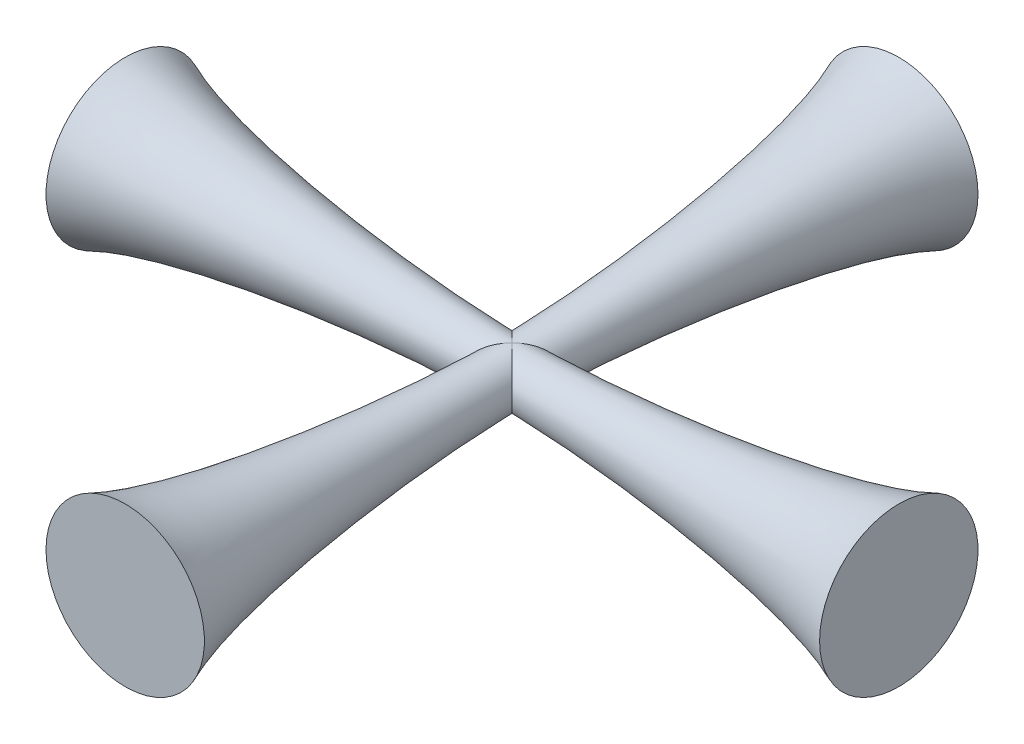
ISO-10303-21;
HEADER;
FILE_DESCRIPTION(('STEP AP214'),'2;1');
FILE_NAME('part.step','',(''),(''),'','','');
FILE_SCHEMA(('AUTOMOTIVE_DESIGN { 1 0 10303 214 1 1 1 1 }'));
ENDSEC;
DATA;
#1=APPLICATION_CONTEXT('core data for automotive mechanical design processes');
#2=APPLICATION_PROTOCOL_DEFINITION('international standard','automotive_design',2000,#1);
#3=PRODUCT_CONTEXT('',#1,'mechanical');
#4=PRODUCT('Part','Part','',(#3));
#5=PRODUCT_RELATED_PRODUCT_CATEGORY('part','',(#4));
#6=PRODUCT_DEFINITION_FORMATION('','',#4);
#7=PRODUCT_DEFINITION_CONTEXT('part definition',#1,'design');
#8=PRODUCT_DEFINITION('design','',#6,#7);
#9=PRODUCT_DEFINITION_SHAPE('','',#8);
#10=(LENGTH_UNIT() NAMED_UNIT(*) SI_UNIT(.MILLI.,.METRE.));
#11=(NAMED_UNIT(*) PLANE_ANGLE_UNIT() SI_UNIT($,.RADIAN.));
#12=(NAMED_UNIT(*) SI_UNIT($,.STERADIAN.) SOLID_ANGLE_UNIT());
#13=UNCERTAINTY_MEASURE_WITH_UNIT(LENGTH_MEASURE(1.E-05),#10,'distance_accuracy_value','');
#14=(GEOMETRIC_REPRESENTATION_CONTEXT(3) GLOBAL_UNCERTAINTY_ASSIGNED_CONTEXT((#13)) GLOBAL_UNIT_ASSIGNED_CONTEXT((#10,
#11,#12)) REPRESENTATION_CONTEXT('',''));
#15=CARTESIAN_POINT('',(0.,0.,0.));
#16=DIRECTION('',(0.,0.,1.));
#17=DIRECTION('',(1.,0.,0.));
#18=AXIS2_PLACEMENT_3D('',#15,#16,#17);
#19=CARTESIAN_POINT('',(-2.3955710363259,0.,0.));
#20=CARTESIAN_POINT('',(-2.3955710363259,0.,10.2699327205121));
#21=CARTESIAN_POINT('',(-4.28164570100792,0.,29.2563574278936));
#22=CARTESIAN_POINT('',(-7.52465435082927,0.,36.7480511164721));
#23=B_SPLINE_CURVE_WITH_KNOTS('',3,(#19,#20,#21,#22),.UNSPECIFIED.,.F.,.F.,(4,4),(0.,1.),.UNSPECIFIED.);
#24=CARTESIAN_POINT('',(0.,0.,0.));
#25=DIRECTION('',(0.,0.,-1.));
#26=AXIS1_PLACEMENT('',#24,#25);
#27=SURFACE_OF_REVOLUTION('',#23,#26);
#28=CARTESIAN_POINT('',(0.,-2.3955710363259,0.));
#29=CARTESIAN_POINT('',(0.00227493935577399,-2.39557102993439,0.00227493935582569));
#30=CARTESIAN_POINT('',(0.00454995332807579,-2.39556788204732,0.00454995332817702));
#31=CARTESIAN_POINT('',(0.195787233078854,-2.39503911701838,0.195787233083027));
#32=CARTESIAN_POINT('',(0.385222800188266,-2.37283706791213,0.385222800189034));
#33=CARTESIAN_POINT('',(0.665238601614039,-2.30595402299188,0.665238601613658));
#34=CARTESIAN_POINT('',(0.758036182530028,-2.27798953292324,0.758036182529928));
#35=CARTESIAN_POINT('',(0.9414549025957,-2.21038980365891,0.941454902595812));
#36=CARTESIAN_POINT('',(1.03207730400936,-2.17076151921702,1.03207730400941));
#37=CARTESIAN_POINT('',(1.24228952666142,-2.06275647634709,1.24228952666139));
#38=CARTESIAN_POINT('',(1.36059587386511,-1.98916632224491,1.36059587386512));
#39=CARTESIAN_POINT('',(1.53097475056382,-1.86057378633172,1.53097475056384));
#40=CARTESIAN_POINT('',(1.58655376734575,-1.81471077374947,1.58655376734577));
#41=CARTESIAN_POINT('',(1.69485278891979,-1.71662369057059,1.69485278891981));
#42=CARTESIAN_POINT('',(1.74757336572099,-1.6644008994845,1.74757336572101));
#43=CARTESIAN_POINT('',(1.83620344773053,-1.56781069115663,1.83620344773055));
#44=CARTESIAN_POINT('',(1.87292314350644,-1.52492526700999,1.87292314350646));
#45=CARTESIAN_POINT('',(1.94405173238328,-1.43550127054337,1.9440517323833));
#46=CARTESIAN_POINT('',(1.97846156298784,-1.38896419715431,1.97846156298786));
#47=CARTESIAN_POINT('',(2.04454376591327,-1.29226401996855,2.04454376591329));
#48=CARTESIAN_POINT('',(2.07622000746715,-1.24210623222427,2.07622000746717));
#49=CARTESIAN_POINT('',(2.13647394408496,-1.13809677840763,2.13647394408498));
#50=CARTESIAN_POINT('',(2.16504783689476,-1.0842407087129,2.16504783689478));
#51=CARTESIAN_POINT('',(2.23419171447741,-0.940511783099403,2.23419171447743));
#52=CARTESIAN_POINT('',(2.2720376163077,-0.847953578869233,2.27203761630772));
#53=CARTESIAN_POINT('',(2.33642768418978,-0.655300202085446,2.3364276841898));
#54=CARTESIAN_POINT('',(2.36298922678303,-0.555216899072572,2.36298922678305));
#55=CARTESIAN_POINT('',(2.39303673698796,-0.400929201225488,2.39303673698798));
#56=CARTESIAN_POINT('',(2.4014347311665,-0.348572882831869,2.40143473116652));
#57=CARTESIAN_POINT('',(2.41472279508979,-0.242989311709561,2.41472279508981));
#58=CARTESIAN_POINT('',(2.41961466683585,-0.189762520776541,2.41961466683588));
#59=CARTESIAN_POINT('',(2.42577724471254,-0.0828969153847346,2.42577724471256));
#60=CARTESIAN_POINT('',(2.42704846678399,-0.0292581607229784,2.42704846678401));
#61=CARTESIAN_POINT('',(2.42594893950019,0.0779336078607394,2.42594893950021));
#62=CARTESIAN_POINT('',(2.42357809498554,0.131486619505823,2.42357809498556));
#63=CARTESIAN_POINT('',(2.41198022608704,0.279532871686772,2.41198022608706));
#64=CARTESIAN_POINT('',(2.39885439606324,0.373466416061126,2.39885439606327));
#65=CARTESIAN_POINT('',(2.36209722504719,0.557032590341713,2.36209722504721));
#66=CARTESIAN_POINT('',(2.3384640869925,0.646664481630636,2.33846408699252));
#67=CARTESIAN_POINT('',(2.28082249375733,0.823834237872705,2.28082249375736));
#68=CARTESIAN_POINT('',(2.24639668227661,0.911098426617761,2.24639668227663));
#69=CARTESIAN_POINT('',(2.1693419029774,1.07798772754097,2.16934190297742));
#70=CARTESIAN_POINT('',(2.12670877524395,1.15760893503891,2.12670877524397));
#71=CARTESIAN_POINT('',(2.00911203307062,1.35112385229108,2.00911203307064));
#72=CARTESIAN_POINT('',(1.92940445549893,1.45927173902625,1.92940445549895));
#73=CARTESIAN_POINT('',(1.75879697899339,1.65624802842602,1.75879697899341));
#74=CARTESIAN_POINT('',(1.66786685365717,1.74502239147581,1.66786685365718));
#75=CARTESIAN_POINT('',(1.43558592763077,1.94018532719165,1.43558592763079));
#76=CARTESIAN_POINT('',(1.28997495924036,2.0364922134815,1.28997495924039));
#77=CARTESIAN_POINT('',(1.06501353268058,2.15456510147779,1.06501353268058));
#78=CARTESIAN_POINT('',(0.988881207762399,2.18953970673688,0.988881207762394));
#79=CARTESIAN_POINT('',(0.834928430825466,2.25109107938603,0.834928430825491));
#80=CARTESIAN_POINT('',(0.757107493917991,2.27766539957914,0.757107493918059));
#81=CARTESIAN_POINT('',(0.457869958624186,2.36356848580993,0.457869958624032));
#82=CARTESIAN_POINT('',(0.231893597129989,2.3949393637041,0.23189359712888));
#83=CARTESIAN_POINT('',(0.00454992907603219,2.39556788130933,0.00454992907601021));
#84=CARTESIAN_POINT('',(0.00227491499322084,2.39557102914761,0.00227491499320995));
#85=CARTESIAN_POINT('',(0.,2.3955710363259,0.));
#86=B_SPLINE_CURVE_WITH_KNOTS('',3,(#28,#29,#30,#31,#32,#33,#34,#35,#36,#37,#38,#39,#40,#41,#42,
#43,#44,#45,#46,#47,#48,#49,#50,#51,#52,#53,#54,#55,#56,#57,#58,#59,#60,#61,#62,#63,#64,#65,#66,
#67,#68,#69,#70,#71,#72,#73,#74,#75,#76,#77,#78,#79,#80,#81,#82,#83,#84,#85),.UNSPECIFIED.,.F.,
.F.,(4,2,2,2,2,2,2,2,2,2,2,2,2,2,2,2,2,2,2,2,2,2,2,2,2,2,2,2,4),(0.,0.00965206298214871,
0.811326268174635,1.2134828387813,1.61540010018501,2.16164207970213,2.43440866442914,
2.70712046219696,2.90901020822897,3.11081751166676,3.31233431620782,3.51409537721341,
3.83353850050745,4.15248792141539,4.31334647336148,4.47412229129119,4.63487519759807,
4.79563230410529,5.08144483487664,5.36730626691352,5.66597341690475,5.96479234815076,
6.43078218501253,6.89805567391461,7.57583668342535,7.91519204187236,8.25464617145168,
9.20949184573508,9.21914390871723),.UNSPECIFIED.);
#87=CARTESIAN_POINT('',(0.,2.3955710363259,0.));
#88=VERTEX_POINT('',#87);
#89=CARTESIAN_POINT('',(0.,-2.3955710363259,0.));
#90=VERTEX_POINT('',#89);
#91=EDGE_CURVE('E73',#88,#90,#86,.F.);
#92=ORIENTED_EDGE('',*,*,#91,.F.);
#93=CARTESIAN_POINT('',(0.,-2.3955710363259,0.));
#94=CARTESIAN_POINT('',(-0.00227493935582533,-2.39557102993439,0.00227493935577381));
#95=CARTESIAN_POINT('',(-0.00454995332817675,-2.39556788204732,0.00454995332807562));
#96=CARTESIAN_POINT('',(-0.195787233083028,-2.39503911701837,0.195787233078847));
#97=CARTESIAN_POINT('',(-0.385222800189029,-2.37283706791213,0.385222800188259));
#98=CARTESIAN_POINT('',(-0.665238601613648,-2.30595402299188,0.665238601614029));
#99=CARTESIAN_POINT('',(-0.758036182529916,-2.27798953292324,0.758036182530017));
#100=CARTESIAN_POINT('',(-0.941454902595794,-2.21038980365891,0.941454902595688));
#101=CARTESIAN_POINT('',(-1.03207730400939,-2.17076151921702,1.03207730400935));
#102=CARTESIAN_POINT('',(-1.24228952666137,-2.0627564763471,1.2422895266614));
#103=CARTESIAN_POINT('',(-1.3605958738651,-1.98916632224491,1.3605958738651));
#104=CARTESIAN_POINT('',(-1.53097475056382,-1.86057378633173,1.53097475056381));
#105=CARTESIAN_POINT('',(-1.58655376734574,-1.81471077374948,1.58655376734574));
#106=CARTESIAN_POINT('',(-1.69485278891979,-1.7166236905706,1.69485278891978));
#107=CARTESIAN_POINT('',(-1.74757336572099,-1.6644008994845,1.74757336572098));
#108=CARTESIAN_POINT('',(-1.83620344773053,-1.56781069115663,1.83620344773052));
#109=CARTESIAN_POINT('',(-1.87292314350643,-1.52492526701,1.87292314350643));
#110=CARTESIAN_POINT('',(-1.94405173238327,-1.43550127054337,1.94405173238327));
#111=CARTESIAN_POINT('',(-1.97846156298783,-1.38896419715431,1.97846156298782));
#112=CARTESIAN_POINT('',(-2.04454376591327,-1.29226401996855,2.04454376591326));
#113=CARTESIAN_POINT('',(-2.07622000746714,-1.24210623222428,2.07622000746714));
#114=CARTESIAN_POINT('',(-2.13647394408496,-1.13809677840764,2.13647394408495));
#115=CARTESIAN_POINT('',(-2.16504783689475,-1.0842407087129,2.16504783689475));
#116=CARTESIAN_POINT('',(-2.2341917144774,-0.940511783099406,2.2341917144774));
#117=CARTESIAN_POINT('',(-2.2720376163077,-0.847953578869235,2.27203761630769));
#118=CARTESIAN_POINT('',(-2.33642768418978,-0.655300202085447,2.33642768418977));
#119=CARTESIAN_POINT('',(-2.36298922678303,-0.555216899072573,2.36298922678302));
#120=CARTESIAN_POINT('',(-2.39303673698796,-0.400929201225487,2.39303673698795));
#121=CARTESIAN_POINT('',(-2.4014347311665,-0.348572882831869,2.40143473116649));
#122=CARTESIAN_POINT('',(-2.41472279508979,-0.24298931170956,2.41472279508978));
#123=CARTESIAN_POINT('',(-2.41961466683585,-0.189762520776539,2.41961466683584));
#124=CARTESIAN_POINT('',(-2.42577724471253,-0.082896915384732,2.42577724471253));
#125=CARTESIAN_POINT('',(-2.42704846678399,-0.0292581607229755,2.42704846678398));
#126=CARTESIAN_POINT('',(-2.42594893950018,0.077933607860743,2.42594893950018));
#127=CARTESIAN_POINT('',(-2.42357809498554,0.131486619505827,2.42357809498553));
#128=CARTESIAN_POINT('',(-2.41198022608703,0.279532871686777,2.41198022608703));
#129=CARTESIAN_POINT('',(-2.39885439606324,0.373466416061131,2.39885439606323));
#130=CARTESIAN_POINT('',(-2.36209722504718,0.55703259034172,2.36209722504718));
#131=CARTESIAN_POINT('',(-2.3384640869925,0.646664481630643,2.33846408699249));
#132=CARTESIAN_POINT('',(-2.28082249375733,0.823834237872714,2.28082249375732));
#133=CARTESIAN_POINT('',(-2.24639668227661,0.911098426617769,2.2463966822766));
#134=CARTESIAN_POINT('',(-2.16934190297739,1.07798772754098,2.16934190297738));
#135=CARTESIAN_POINT('',(-2.12670877524395,1.15760893503892,2.12670877524394));
#136=CARTESIAN_POINT('',(-2.00911203307061,1.35112385229109,2.00911203307061));
#137=CARTESIAN_POINT('',(-1.92940445549892,1.45927173902626,1.92940445549892));
#138=CARTESIAN_POINT('',(-1.75879697899338,1.65624802842603,1.75879697899337));
#139=CARTESIAN_POINT('',(-1.66786685365715,1.74502239147582,1.66786685365715));
#140=CARTESIAN_POINT('',(-1.43558592763075,1.94018532719166,1.43558592763075));
#141=CARTESIAN_POINT('',(-1.28997495924034,2.03649221348151,1.28997495924036));
#142=CARTESIAN_POINT('',(-1.06501353268057,2.1545651014778,1.06501353268055));
#143=CARTESIAN_POINT('',(-0.988881207762394,2.18953970673689,0.988881207762359));
#144=CARTESIAN_POINT('',(-0.834928430825444,2.25109107938604,0.834928430825474));
#145=CARTESIAN_POINT('',(-0.757107493917949,2.27766539957915,0.757107493918064));
#146=CARTESIAN_POINT('',(-0.45786995862426,2.36356848580993,0.457869958623934));
#147=CARTESIAN_POINT('',(-0.231893597130548,2.39493936370409,0.231893597128308));
#148=CARTESIAN_POINT('',(-0.00454992907604367,2.39556788130933,0.00454992907599833));
#149=CARTESIAN_POINT('',(-0.00227491499322668,2.39557102914761,0.00227491499320373));
#150=CARTESIAN_POINT('',(0.,2.3955710363259,0.));
#151=B_SPLINE_CURVE_WITH_KNOTS('',3,(#93,#94,#95,#96,#97,#98,#99,#100,#101,#102,#103,#104,#105,
#106,#107,#108,#109,#110,#111,#112,#113,#114,#115,#116,#117,#118,#119,#120,#121,#122,#123,#124,
#125,#126,#127,#128,#129,#130,#131,#132,#133,#134,#135,#136,#137,#138,#139,#140,#141,#142,#143,
#144,#145,#146,#147,#148,#149,#150),.UNSPECIFIED.,.F.,.F.,(4,2,2,2,2,2,2,2,2,2,2,2,2,2,2,2,2,2,
2,2,2,2,2,2,2,2,2,2,4),(0.,0.00965206298214894,0.811326268174624,1.21348283878128,
1.61540010018498,2.16164207970211,2.43440866442911,2.70712046219693,2.90901020822895,
3.11081751166674,3.3123343162078,3.51409537721339,3.83353850050743,4.15248792141537,
4.31334647336146,4.47412229129117,4.63487519759805,4.79563230410527,5.08144483487663,
5.3673062669135,5.66597341690474,5.96479234815075,6.43078218501252,6.89805567391461,
7.57583668342534,7.91519204187234,8.25464617145167,9.20949184573504,9.21914390871719),.UNSPECIFIED.);
#152=EDGE_CURVE('E65',#90,#88,#151,.T.);
#153=ORIENTED_EDGE('',*,*,#152,.F.);
#154=EDGE_LOOP('',(#92,#153));
#155=FACE_BOUND('',#154,.T.);
#156=CARTESIAN_POINT('',(0.,0.,36.7480511164721));
#157=DIRECTION('',(0.,0.,-1.));
#158=DIRECTION('',(-1.,0.,0.));
#159=AXIS2_PLACEMENT_3D('',#156,#157,#158);
#160=CIRCLE('',#159,7.52465435082927);
#161=CARTESIAN_POINT('',(-7.52465435082927,0.,36.7480511164721));
#162=VERTEX_POINT('',#161);
#163=EDGE_CURVE('E71',#162,#162,#160,.T.);
#164=ORIENTED_EDGE('',*,*,#163,.T.);
#165=EDGE_LOOP('',(#164));
#166=FACE_BOUND('',#165,.T.);
#167=ADVANCED_FACE('F39',(#155,#166),#27,.F.);
#168=CARTESIAN_POINT('',(0.,0.,36.7480511164721));
#169=DIRECTION('',(0.,0.,1.));
#170=DIRECTION('',(1.,0.,0.));
#171=AXIS2_PLACEMENT_3D('',#168,#169,#170);
#172=PLANE('',#171);
#173=ORIENTED_EDGE('',*,*,#163,.F.);
#174=EDGE_LOOP('',(#173));
#175=FACE_BOUND('',#174,.T.);
#176=ADVANCED_FACE('F96',(#175),#172,.T.);
#177=CARTESIAN_POINT('',(0.,0.,-2.3955710363259));
#178=CARTESIAN_POINT('',(-10.2699327205121,0.,-2.39557103632593));
#179=CARTESIAN_POINT('',(-29.2563574278936,0.,-4.28164570100802));
#180=CARTESIAN_POINT('',(-36.7480511164721,0.,-7.5246543508294));
#181=B_SPLINE_CURVE_WITH_KNOTS('',3,(#177,#178,#179,#180),.UNSPECIFIED.,.F.,.F.,(4,4),(0.,1.),.UNSPECIFIED.);
#182=CARTESIAN_POINT('',(0.,0.,0.));
#183=DIRECTION('',(1.,0.,0.));
#184=AXIS1_PLACEMENT('',#182,#183);
#185=SURFACE_OF_REVOLUTION('',#181,#184);
#186=CARTESIAN_POINT('',(0.,-2.3955710363259,0.));
#187=CARTESIAN_POINT('',(-0.00227493935577377,-2.39557102993439,-0.00227493935582537));
#188=CARTESIAN_POINT('',(-0.0045499533280756,-2.39556788204732,-0.00454995332817677));
#189=CARTESIAN_POINT('',(-0.19578723307885,-2.39503911701837,-0.195787233083028));
#190=CARTESIAN_POINT('',(-0.385222800188263,-2.37283706791213,-0.385222800189032));
#191=CARTESIAN_POINT('',(-0.665238601614034,-2.30595402299188,-0.665238601613654));
#192=CARTESIAN_POINT('',(-0.758036182530022,-2.27798953292324,-0.758036182529923));
#193=CARTESIAN_POINT('',(-0.941454902595694,-2.21038980365891,-0.941454902595803));
#194=CARTESIAN_POINT('',(-1.03207730400936,-2.17076151921702,-1.03207730400939));
#195=CARTESIAN_POINT('',(-1.24228952666141,-2.06275647634709,-1.24228952666137));
#196=CARTESIAN_POINT('',(-1.36059587386511,-1.98916632224491,-1.36059587386511));
#197=CARTESIAN_POINT('',(-1.53097475056382,-1.86057378633173,-1.53097475056383));
#198=CARTESIAN_POINT('',(-1.58655376734574,-1.81471077374947,-1.58655376734575));
#199=CARTESIAN_POINT('',(-1.69485278891979,-1.7166236905706,-1.69485278891979));
#200=CARTESIAN_POINT('',(-1.74757336572099,-1.6644008994845,-1.747573365721));
#201=CARTESIAN_POINT('',(-1.83620344773053,-1.56781069115663,-1.83620344773054));
#202=CARTESIAN_POINT('',(-1.87292314350644,-1.52492526700999,-1.87292314350644));
#203=CARTESIAN_POINT('',(-1.94405173238328,-1.43550127054337,-1.94405173238328));
#204=CARTESIAN_POINT('',(-1.97846156298783,-1.38896419715431,-1.97846156298784));
#205=CARTESIAN_POINT('',(-2.04454376591327,-1.29226401996855,-2.04454376591328));
#206=CARTESIAN_POINT('',(-2.07622000746715,-1.24210623222428,-2.07622000746715));
#207=CARTESIAN_POINT('',(-2.13647394408496,-1.13809677840763,-2.13647394408496));
#208=CARTESIAN_POINT('',(-2.16504783689475,-1.0842407087129,-2.16504783689476));
#209=CARTESIAN_POINT('',(-2.2341917144774,-0.940511783099405,-2.23419171447741));
#210=CARTESIAN_POINT('',(-2.2720376163077,-0.847953578869235,-2.2720376163077));
#211=CARTESIAN_POINT('',(-2.33642768418978,-0.655300202085449,-2.33642768418979));
#212=CARTESIAN_POINT('',(-2.36298922678303,-0.555216899072574,-2.36298922678304));
#213=CARTESIAN_POINT('',(-2.39303673698796,-0.40092920122549,-2.39303673698796));
#214=CARTESIAN_POINT('',(-2.4014347311665,-0.348572882831871,-2.40143473116651));
#215=CARTESIAN_POINT('',(-2.41472279508979,-0.242989311709563,-2.4147227950898));
#216=CARTESIAN_POINT('',(-2.41961466683585,-0.189762520776542,-2.41961466683586));
#217=CARTESIAN_POINT('',(-2.42577724471254,-0.0828969153847356,-2.42577724471254));
#218=CARTESIAN_POINT('',(-2.42704846678399,-0.0292581607229792,-2.427048466784));
#219=CARTESIAN_POINT('',(-2.42594893950018,0.0779336078607391,-2.42594893950019));
#220=CARTESIAN_POINT('',(-2.42357809498554,0.131486619505822,-2.42357809498555));
#221=CARTESIAN_POINT('',(-2.41198022608703,0.279532871686773,-2.41198022608704));
#222=CARTESIAN_POINT('',(-2.39885439606324,0.373466416061127,-2.39885439606325));
#223=CARTESIAN_POINT('',(-2.36209722504719,0.557032590341714,-2.36209722504719));
#224=CARTESIAN_POINT('',(-2.3384640869925,0.646664481630638,-2.33846408699251));
#225=CARTESIAN_POINT('',(-2.28082249375733,0.823834237872708,-2.28082249375734));
#226=CARTESIAN_POINT('',(-2.24639668227661,0.911098426617763,-2.24639668227662));
#227=CARTESIAN_POINT('',(-2.1693419029774,1.07798772754097,-2.1693419029774));
#228=CARTESIAN_POINT('',(-2.12670877524395,1.15760893503891,-2.12670877524396));
#229=CARTESIAN_POINT('',(-2.00911203307062,1.35112385229109,-2.00911203307063));
#230=CARTESIAN_POINT('',(-1.92940445549893,1.45927173902625,-1.92940445549894));
#231=CARTESIAN_POINT('',(-1.75879697899339,1.65624802842602,-1.75879697899339));
#232=CARTESIAN_POINT('',(-1.66786685365716,1.74502239147581,-1.66786685365717));
#233=CARTESIAN_POINT('',(-1.43558592763076,1.94018532719165,-1.43558592763077));
#234=CARTESIAN_POINT('',(-1.28997495924036,2.03649221348151,-1.28997495924037));
#235=CARTESIAN_POINT('',(-1.06501353268057,2.1545651014778,-1.06501353268057));
#236=CARTESIAN_POINT('',(-0.988881207762394,2.18953970673688,-0.988881207762383));
#237=CARTESIAN_POINT('',(-0.834928430825461,2.25109107938604,-0.834928430825482));
#238=CARTESIAN_POINT('',(-0.757107493917987,2.27766539957915,-0.757107493918049));
#239=CARTESIAN_POINT('',(-0.457869958624183,2.36356848580993,-0.457869958624028));
#240=CARTESIAN_POINT('',(-0.231893597129978,2.39493936370409,-0.231893597128887));
#241=CARTESIAN_POINT('',(-0.00454992907603235,2.39556788130933,-0.00454992907601014));
#242=CARTESIAN_POINT('',(-0.00227491499322112,2.39557102914761,-0.00227491499320982));
#243=CARTESIAN_POINT('',(0.,2.3955710363259,0.));
#244=B_SPLINE_CURVE_WITH_KNOTS('',3,(#186,#187,#188,#189,#190,#191,#192,#193,#194,#195,#196,
#197,#198,#199,#200,#201,#202,#203,#204,#205,#206,#207,#208,#209,#210,#211,#212,#213,#214,#215,
#216,#217,#218,#219,#220,#221,#222,#223,#224,#225,#226,#227,#228,#229,#230,#231,#232,#233,#234,
#235,#236,#237,#238,#239,#240,#241,#242,#243),.UNSPECIFIED.,.F.,.F.,(4,2,2,2,2,2,2,2,2,2,2,2,2,
2,2,2,2,2,2,2,2,2,2,2,2,2,2,2,4),(0.,0.00965206298214894,0.811326268174631,1.21348283878129,
1.61540010018499,2.16164207970212,2.43440866442913,2.70712046219694,2.90901020822896,
3.11081751166675,3.31233431620781,3.5140953772134,3.83353850050744,4.15248792141537,
4.31334647336147,4.47412229129118,4.63487519759806,4.79563230410528,5.08144483487663,
5.36730626691351,5.66597341690474,5.96479234815075,6.43078218501252,6.89805567391461,
7.57583668342534,7.91519204187235,8.25464617145167,9.20949184573506,9.21914390871721),.UNSPECIFIED.);
#245=EDGE_CURVE('E54',#90,#88,#244,.T.);
#246=ORIENTED_EDGE('',*,*,#245,.F.);
#247=ORIENTED_EDGE('',*,*,#152,.T.);
#248=EDGE_LOOP('',(#246,#247));
#249=FACE_BOUND('',#248,.T.);
#250=CARTESIAN_POINT('',(-36.7480511164721,0.,-1.28305134712016E-13));
#251=DIRECTION('',(1.,0.,0.));
#252=DIRECTION('',(0.,0.,-1.));
#253=AXIS2_PLACEMENT_3D('',#250,#251,#252);
#254=CIRCLE('',#253,7.52465435082927);
#255=CARTESIAN_POINT('',(-36.7480511164721,0.,-7.5246543508294));
#256=VERTEX_POINT('',#255);
#257=EDGE_CURVE('E117',#256,#256,#254,.T.);
#258=ORIENTED_EDGE('',*,*,#257,.T.);
#259=EDGE_LOOP('',(#258));
#260=FACE_BOUND('',#259,.T.);
#261=ADVANCED_FACE('F67',(#249,#260),#185,.F.);
#262=CARTESIAN_POINT('',(-36.7480511164721,0.,-1.28305134712016E-13));
#263=DIRECTION('',(-1.,0.,0.));
#264=DIRECTION('',(0.,0.,1.));
#265=AXIS2_PLACEMENT_3D('',#262,#263,#264);
#266=PLANE('',#265);
#267=ORIENTED_EDGE('',*,*,#257,.F.);
#268=EDGE_LOOP('',(#267));
#269=FACE_BOUND('',#268,.T.);
#270=ADVANCED_FACE('F104',(#269),#266,.T.);
#271=CARTESIAN_POINT('',(2.3955710363259,0.,0.));
#272=CARTESIAN_POINT('',(2.3955710363259,0.,-10.2699327205121));
#273=CARTESIAN_POINT('',(4.28164570100792,0.,-29.2563574278936));
#274=CARTESIAN_POINT('',(7.52465435082927,0.,-36.7480511164721));
#275=B_SPLINE_CURVE_WITH_KNOTS('',3,(#271,#272,#273,#274),.UNSPECIFIED.,.F.,.F.,(4,4),(0.,1.),.UNSPECIFIED.);
#276=CARTESIAN_POINT('',(0.,0.,0.));
#277=DIRECTION('',(0.,0.,1.));
#278=AXIS1_PLACEMENT('',#276,#277);
#279=SURFACE_OF_REVOLUTION('',#275,#278);
#280=CARTESIAN_POINT('',(0.,-2.3955710363259,0.));
#281=CARTESIAN_POINT('',(0.00227493935582538,-2.39557102993439,-0.00227493935577381));
#282=CARTESIAN_POINT('',(0.00454995332817679,-2.39556788204732,-0.00454995332807563));
#283=CARTESIAN_POINT('',(0.195787233083026,-2.39503911701837,-0.195787233078847));
#284=CARTESIAN_POINT('',(0.385222800189027,-2.37283706791213,-0.385222800188257));
#285=CARTESIAN_POINT('',(0.665238601613647,-2.30595402299188,-0.665238601614023));
#286=CARTESIAN_POINT('',(0.758036182529915,-2.27798953292324,-0.758036182530008));
#287=CARTESIAN_POINT('',(0.941454902595793,-2.21038980365891,-0.941454902595677));
#288=CARTESIAN_POINT('',(1.03207730400938,-2.17076151921702,-1.03207730400934));
#289=CARTESIAN_POINT('',(1.24228952666136,-2.0627564763471,-1.24228952666139));
#290=CARTESIAN_POINT('',(1.3605958738651,-1.98916632224491,-1.36059587386509));
#291=CARTESIAN_POINT('',(1.53097475056382,-1.86057378633173,-1.53097475056379));
#292=CARTESIAN_POINT('',(1.58655376734574,-1.81471077374948,-1.58655376734572));
#293=CARTESIAN_POINT('',(1.69485278891978,-1.7166236905706,-1.69485278891977));
#294=CARTESIAN_POINT('',(1.74757336572098,-1.6644008994845,-1.74757336572097));
#295=CARTESIAN_POINT('',(1.83620344773053,-1.56781069115663,-1.83620344773051));
#296=CARTESIAN_POINT('',(1.87292314350643,-1.52492526701,-1.87292314350641));
#297=CARTESIAN_POINT('',(1.94405173238327,-1.43550127054337,-1.94405173238325));
#298=CARTESIAN_POINT('',(1.97846156298783,-1.38896419715432,-1.97846156298781));
#299=CARTESIAN_POINT('',(2.04454376591327,-1.29226401996855,-2.04454376591324));
#300=CARTESIAN_POINT('',(2.07622000746714,-1.24210623222428,-2.07622000746712));
#301=CARTESIAN_POINT('',(2.13647394408495,-1.13809677840764,-2.13647394408493));
#302=CARTESIAN_POINT('',(2.16504783689475,-1.0842407087129,-2.16504783689473));
#303=CARTESIAN_POINT('',(2.2341917144774,-0.940511783099407,-2.23419171447738));
#304=CARTESIAN_POINT('',(2.2720376163077,-0.847953578869237,-2.27203761630767));
#305=CARTESIAN_POINT('',(2.33642768418978,-0.655300202085448,-2.33642768418975));
#306=CARTESIAN_POINT('',(2.36298922678303,-0.555216899072573,-2.362989226783));
#307=CARTESIAN_POINT('',(2.39303673698796,-0.400929201225487,-2.39303673698793));
#308=CARTESIAN_POINT('',(2.4014347311665,-0.348572882831868,-2.40143473116647));
#309=CARTESIAN_POINT('',(2.41472279508979,-0.242989311709559,-2.41472279508976));
#310=CARTESIAN_POINT('',(2.41961466683585,-0.189762520776538,-2.41961466683582));
#311=CARTESIAN_POINT('',(2.42577724471253,-0.0828969153847309,-2.42577724471251));
#312=CARTESIAN_POINT('',(2.42704846678399,-0.0292581607229741,-2.42704846678396));
#313=CARTESIAN_POINT('',(2.42594893950018,0.0779336078607448,-2.42594893950016));
#314=CARTESIAN_POINT('',(2.42357809498554,0.131486619505828,-2.42357809498551));
#315=CARTESIAN_POINT('',(2.41198022608703,0.27953287168678,-2.41198022608701));
#316=CARTESIAN_POINT('',(2.39885439606324,0.373466416061134,-2.39885439606321));
#317=CARTESIAN_POINT('',(2.36209722504718,0.557032590341723,-2.36209722504716));
#318=CARTESIAN_POINT('',(2.3384640869925,0.646664481630647,-2.33846408699247));
#319=CARTESIAN_POINT('',(2.28082249375733,0.823834237872718,-2.2808224937573));
#320=CARTESIAN_POINT('',(2.2463966822766,0.911098426617774,-2.24639668227658));
#321=CARTESIAN_POINT('',(2.16934190297739,1.07798772754098,-2.16934190297737));
#322=CARTESIAN_POINT('',(2.12670877524394,1.15760893503893,-2.12670877524392));
#323=CARTESIAN_POINT('',(2.00911203307061,1.3511238522911,-2.00911203307059));
#324=CARTESIAN_POINT('',(1.92940445549892,1.45927173902626,-1.9294044554989));
#325=CARTESIAN_POINT('',(1.75879697899338,1.65624802842603,-1.75879697899336));
#326=CARTESIAN_POINT('',(1.66786685365715,1.74502239147582,-1.66786685365713));
#327=CARTESIAN_POINT('',(1.43558592763075,1.94018532719166,-1.43558592763074));
#328=CARTESIAN_POINT('',(1.28997495924034,2.03649221348152,-1.28997495924034));
#329=CARTESIAN_POINT('',(1.06501353268056,2.1545651014778,-1.06501353268054));
#330=CARTESIAN_POINT('',(0.988881207762379,2.18953970673689,-0.988881207762353));
#331=CARTESIAN_POINT('',(0.834928430825446,2.25109107938604,-0.834928430825453));
#332=CARTESIAN_POINT('',(0.757107493917972,2.27766539957915,-0.757107493918021));
#333=CARTESIAN_POINT('',(0.457869958624165,2.36356848580993,-0.457869958624016));
#334=CARTESIAN_POINT('',(0.231893597129943,2.39493936370409,-0.231893597128907));
#335=CARTESIAN_POINT('',(0.00454992907603145,2.39556788130933,-0.00454992907601028));
#336=CARTESIAN_POINT('',(0.00227491499322058,2.39557102914761,-0.00227491499320976));
#337=CARTESIAN_POINT('',(0.,2.3955710363259,0.));
#338=B_SPLINE_CURVE_WITH_KNOTS('',3,(#280,#281,#282,#283,#284,#285,#286,#287,#288,#289,#290,
#291,#292,#293,#294,#295,#296,#297,#298,#299,#300,#301,#302,#303,#304,#305,#306,#307,#308,#309,
#310,#311,#312,#313,#314,#315,#316,#317,#318,#319,#320,#321,#322,#323,#324,#325,#326,#327,#328,
#329,#330,#331,#332,#333,#334,#335,#336,#337),.UNSPECIFIED.,.F.,.F.,(4,2,2,2,2,2,2,2,2,2,2,2,2,
2,2,2,2,2,2,2,2,2,2,2,2,2,2,2,4),(0.,0.00965206298214892,0.811326268174619,1.21348283878127,
1.61540010018497,2.16164207970209,2.4344086644291,2.70712046219692,2.90901020822894,
3.11081751166672,3.31233431620779,3.51409537721338,3.83353850050742,4.15248792141535,
4.31334647336145,4.47412229129116,4.63487519759804,4.79563230410527,5.08144483487662,
5.3673062669135,5.66597341690473,5.96479234815075,6.43078218501252,6.89805567391461,
7.57583668342533,7.91519204187234,8.25464617145166,9.20949184573502,9.21914390871717),.UNSPECIFIED.);
#339=EDGE_CURVE('E11',#90,#88,#338,.T.);
#340=ORIENTED_EDGE('',*,*,#339,.F.);
#341=ORIENTED_EDGE('',*,*,#245,.T.);
#342=EDGE_LOOP('',(#340,#341));
#343=FACE_BOUND('',#342,.T.);
#344=CARTESIAN_POINT('',(0.,0.,-36.7480511164721));
#345=DIRECTION('',(0.,0.,1.));
#346=DIRECTION('',(1.,0.,0.));
#347=AXIS2_PLACEMENT_3D('',#344,#345,#346);
#348=CIRCLE('',#347,7.52465435082927);
#349=CARTESIAN_POINT('',(7.52465435082927,0.,-36.7480511164721));
#350=VERTEX_POINT('',#349);
#351=EDGE_CURVE('E76',#350,#350,#348,.T.);
#352=ORIENTED_EDGE('',*,*,#351,.T.);
#353=EDGE_LOOP('',(#352));
#354=FACE_BOUND('',#353,.T.);
#355=ADVANCED_FACE('F61',(#343,#354),#279,.F.);
#356=CARTESIAN_POINT('',(0.,0.,-36.7480511164721));
#357=DIRECTION('',(0.,0.,-1.));
#358=DIRECTION('',(-1.,0.,0.));
#359=AXIS2_PLACEMENT_3D('',#356,#357,#358);
#360=PLANE('',#359);
#361=ORIENTED_EDGE('',*,*,#351,.F.);
#362=EDGE_LOOP('',(#361));
#363=FACE_BOUND('',#362,.T.);
#364=ADVANCED_FACE('F82',(#363),#360,.T.);
#365=CARTESIAN_POINT('',(0.,0.,2.3955710363259));
#366=CARTESIAN_POINT('',(10.2699327205121,0.,2.395571036326));
#367=CARTESIAN_POINT('',(29.2563574278936,0.,4.28164570100823));
#368=CARTESIAN_POINT('',(36.748051116472,0.,7.52465435082966));
#369=B_SPLINE_CURVE_WITH_KNOTS('',3,(#365,#366,#367,#368),.UNSPECIFIED.,.F.,.F.,(4,4),(0.,1.),.UNSPECIFIED.);
#370=CARTESIAN_POINT('',(0.,0.,0.));
#371=DIRECTION('',(-1.,0.,0.));
#372=AXIS1_PLACEMENT('',#370,#371);
#373=SURFACE_OF_REVOLUTION('',#369,#372);
#374=CARTESIAN_POINT('',(36.7480511164721,0.,3.84915404136048E-13));
#375=DIRECTION('',(-1.,0.,0.));
#376=DIRECTION('',(0.,0.,1.));
#377=AXIS2_PLACEMENT_3D('',#374,#375,#376);
#378=CIRCLE('',#377,7.52465435082927);
#379=CARTESIAN_POINT('',(36.748051116472,0.,7.52465435082966));
#380=VERTEX_POINT('',#379);
#381=EDGE_CURVE('E77',#380,#380,#378,.T.);
#382=ORIENTED_EDGE('',*,*,#381,.T.);
#383=EDGE_LOOP('',(#382));
#384=FACE_BOUND('',#383,.T.);
#385=ORIENTED_EDGE('',*,*,#339,.T.);
#386=ORIENTED_EDGE('',*,*,#91,.T.);
#387=EDGE_LOOP('',(#385,#386));
#388=FACE_BOUND('',#387,.T.);
#389=ADVANCED_FACE('F79',(#384,#388),#373,.F.);
#390=CARTESIAN_POINT('',(36.7480511164721,0.,3.84915404136048E-13));
#391=DIRECTION('',(1.,0.,0.));
#392=DIRECTION('',(0.,0.,-1.));
#393=AXIS2_PLACEMENT_3D('',#390,#391,#392);
#394=PLANE('',#393);
#395=ORIENTED_EDGE('',*,*,#381,.F.);
#396=EDGE_LOOP('',(#395));
#397=FACE_BOUND('',#396,.T.);
#398=ADVANCED_FACE('F81',(#397),#394,.T.);
#399=CLOSED_SHELL('',(#167,#176,#261,#270,#355,#364,#389,#398));
#400=MANIFOLD_SOLID_BREP('B2',#399);
#401=ADVANCED_BREP_SHAPE_REPRESENTATION('',(#18,#400),#14);
#402=SHAPE_DEFINITION_REPRESENTATION(#9,#401);
ENDSEC;
END-ISO-10303-21;
